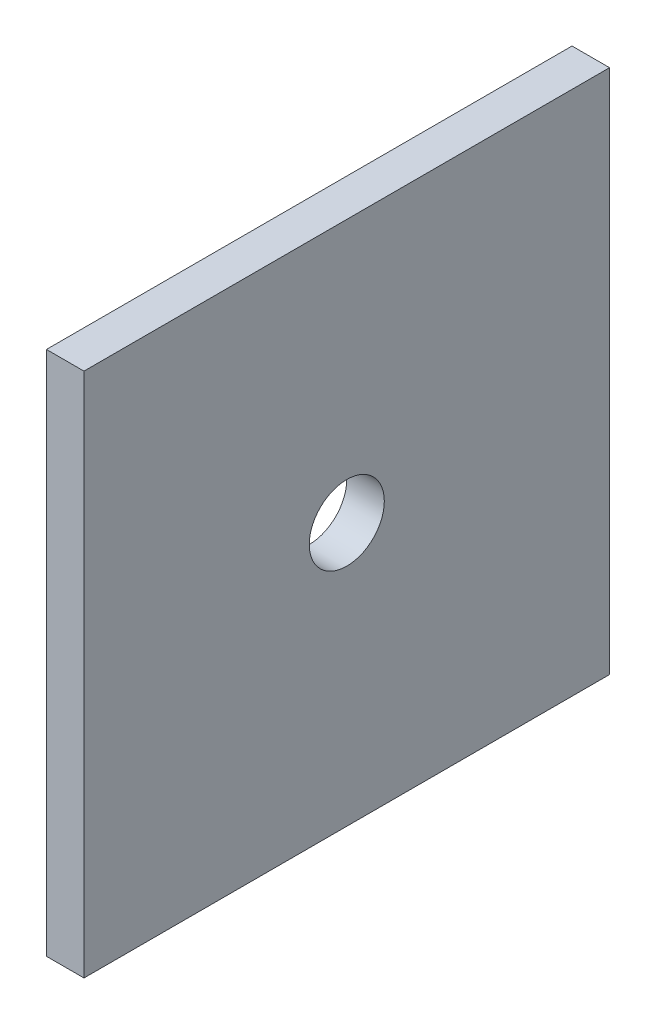
ISO-10303-21;
HEADER;
FILE_DESCRIPTION(('STEP AP214'),'2;1');
FILE_NAME('part.step','',(''),(''),'','','');
FILE_SCHEMA(('AUTOMOTIVE_DESIGN { 1 0 10303 214 1 1 1 1 }'));
ENDSEC;
DATA;
#1=APPLICATION_CONTEXT('core data for automotive mechanical design processes');
#2=APPLICATION_PROTOCOL_DEFINITION('international standard','automotive_design',2000,#1);
#3=PRODUCT_CONTEXT('',#1,'mechanical');
#4=PRODUCT('Part','Part','',(#3));
#5=PRODUCT_RELATED_PRODUCT_CATEGORY('part','',(#4));
#6=PRODUCT_DEFINITION_FORMATION('','',#4);
#7=PRODUCT_DEFINITION_CONTEXT('part definition',#1,'design');
#8=PRODUCT_DEFINITION('design','',#6,#7);
#9=PRODUCT_DEFINITION_SHAPE('','',#8);
#10=(LENGTH_UNIT() NAMED_UNIT(*) SI_UNIT(.MILLI.,.METRE.));
#11=(NAMED_UNIT(*) PLANE_ANGLE_UNIT() SI_UNIT($,.RADIAN.));
#12=(NAMED_UNIT(*) SI_UNIT($,.STERADIAN.) SOLID_ANGLE_UNIT());
#13=UNCERTAINTY_MEASURE_WITH_UNIT(LENGTH_MEASURE(1.E-05),#10,'distance_accuracy_value','');
#14=(GEOMETRIC_REPRESENTATION_CONTEXT(3) GLOBAL_UNCERTAINTY_ASSIGNED_CONTEXT((#13)) GLOBAL_UNIT_ASSIGNED_CONTEXT((#10,
#11,#12)) REPRESENTATION_CONTEXT('',''));
#15=CARTESIAN_POINT('',(0.,0.,0.));
#16=DIRECTION('',(0.,0.,1.));
#17=DIRECTION('',(1.,0.,0.));
#18=AXIS2_PLACEMENT_3D('',#15,#16,#17);
#19=CARTESIAN_POINT('',(5.,0.,0.));
#20=DIRECTION('',(1.,0.,0.));
#21=DIRECTION('',(0.,0.,-1.));
#22=AXIS2_PLACEMENT_3D('',#19,#20,#21);
#23=PLANE('',#22);
#24=DIRECTION('',(0.,-1.,0.));
#25=VECTOR('',#24,1.);
#26=CARTESIAN_POINT('',(5.,-35.,35.));
#27=LINE('',#26,#25);
#28=CARTESIAN_POINT('',(5.,35.,35.));
#29=VERTEX_POINT('',#28);
#30=CARTESIAN_POINT('',(5.,-35.,35.));
#31=VERTEX_POINT('',#30);
#32=EDGE_CURVE('E86',#29,#31,#27,.T.);
#33=ORIENTED_EDGE('',*,*,#32,.T.);
#34=DIRECTION('',(0.,0.,-1.));
#35=VECTOR('',#34,1.);
#36=CARTESIAN_POINT('',(5.,-35.,-35.));
#37=LINE('',#36,#35);
#38=CARTESIAN_POINT('',(5.,-35.,-35.));
#39=VERTEX_POINT('',#38);
#40=EDGE_CURVE('E81',#31,#39,#37,.T.);
#41=ORIENTED_EDGE('',*,*,#40,.T.);
#42=DIRECTION('',(0.,1.,0.));
#43=VECTOR('',#42,1.);
#44=CARTESIAN_POINT('',(5.,-35.,-35.));
#45=LINE('',#44,#43);
#46=CARTESIAN_POINT('',(5.,35.,-35.));
#47=VERTEX_POINT('',#46);
#48=EDGE_CURVE('E84',#39,#47,#45,.T.);
#49=ORIENTED_EDGE('',*,*,#48,.T.);
#50=DIRECTION('',(0.,0.,1.));
#51=VECTOR('',#50,1.);
#52=CARTESIAN_POINT('',(5.,35.,-35.));
#53=LINE('',#52,#51);
#54=EDGE_CURVE('E51',#47,#29,#53,.T.);
#55=ORIENTED_EDGE('',*,*,#54,.T.);
#56=EDGE_LOOP('',(#33,#41,#49,#55));
#57=FACE_BOUND('',#56,.T.);
#58=CARTESIAN_POINT('',(5.,0.,0.));
#59=DIRECTION('',(1.,0.,0.));
#60=DIRECTION('',(0.,0.,-1.));
#61=AXIS2_PLACEMENT_3D('',#58,#59,#60);
#62=CIRCLE('',#61,5.);
#63=CARTESIAN_POINT('',(5.,0.,-5.));
#64=VERTEX_POINT('',#63);
#65=EDGE_CURVE('E101',#64,#64,#62,.T.);
#66=ORIENTED_EDGE('',*,*,#65,.F.);
#67=EDGE_LOOP('',(#66));
#68=FACE_BOUND('',#67,.T.);
#69=ADVANCED_FACE('F34',(#57,#68),#23,.T.);
#70=CARTESIAN_POINT('',(0.,0.,0.));
#71=DIRECTION('',(1.,0.,0.));
#72=DIRECTION('',(0.,0.,-1.));
#73=AXIS2_PLACEMENT_3D('',#70,#71,#72);
#74=PLANE('',#73);
#75=DIRECTION('',(0.,-1.,0.));
#76=VECTOR('',#75,1.);
#77=CARTESIAN_POINT('',(0.,-35.,35.));
#78=LINE('',#77,#76);
#79=CARTESIAN_POINT('',(0.,35.,35.));
#80=VERTEX_POINT('',#79);
#81=CARTESIAN_POINT('',(0.,-35.,35.));
#82=VERTEX_POINT('',#81);
#83=EDGE_CURVE('E98',#80,#82,#78,.T.);
#84=ORIENTED_EDGE('',*,*,#83,.F.);
#85=DIRECTION('',(0.,0.,1.));
#86=VECTOR('',#85,1.);
#87=CARTESIAN_POINT('',(0.,35.,-35.));
#88=LINE('',#87,#86);
#89=CARTESIAN_POINT('',(0.,35.,-35.));
#90=VERTEX_POINT('',#89);
#91=EDGE_CURVE('E74',#90,#80,#88,.T.);
#92=ORIENTED_EDGE('',*,*,#91,.F.);
#93=DIRECTION('',(0.,1.,0.));
#94=VECTOR('',#93,1.);
#95=CARTESIAN_POINT('',(0.,-35.,-35.));
#96=LINE('',#95,#94);
#97=CARTESIAN_POINT('',(0.,-35.,-35.));
#98=VERTEX_POINT('',#97);
#99=EDGE_CURVE('E68',#98,#90,#96,.T.);
#100=ORIENTED_EDGE('',*,*,#99,.F.);
#101=DIRECTION('',(0.,0.,-1.));
#102=VECTOR('',#101,1.);
#103=CARTESIAN_POINT('',(0.,-35.,-35.));
#104=LINE('',#103,#102);
#105=EDGE_CURVE('E90',#82,#98,#104,.T.);
#106=ORIENTED_EDGE('',*,*,#105,.F.);
#107=EDGE_LOOP('',(#84,#92,#100,#106));
#108=FACE_BOUND('',#107,.T.);
#109=CARTESIAN_POINT('',(0.,0.,0.));
#110=DIRECTION('',(1.,0.,0.));
#111=DIRECTION('',(0.,0.,-1.));
#112=AXIS2_PLACEMENT_3D('',#109,#110,#111);
#113=CIRCLE('',#112,5.);
#114=CARTESIAN_POINT('',(0.,0.,-5.));
#115=VERTEX_POINT('',#114);
#116=EDGE_CURVE('E113',#115,#115,#113,.T.);
#117=ORIENTED_EDGE('',*,*,#116,.T.);
#118=EDGE_LOOP('',(#117));
#119=FACE_BOUND('',#118,.T.);
#120=ADVANCED_FACE('F109',(#108,#119),#74,.F.);
#121=CARTESIAN_POINT('',(5.,-35.,35.));
#122=DIRECTION('',(0.,0.,-1.));
#123=DIRECTION('',(-1.,0.,0.));
#124=AXIS2_PLACEMENT_3D('',#121,#122,#123);
#125=PLANE('',#124);
#126=ORIENTED_EDGE('',*,*,#83,.T.);
#127=DIRECTION('',(-1.,0.,0.));
#128=VECTOR('',#127,1.);
#129=CARTESIAN_POINT('',(5.,-35.,35.));
#130=LINE('',#129,#128);
#131=EDGE_CURVE('E11',#31,#82,#130,.T.);
#132=ORIENTED_EDGE('',*,*,#131,.F.);
#133=ORIENTED_EDGE('',*,*,#32,.F.);
#134=DIRECTION('',(-1.,0.,0.));
#135=VECTOR('',#134,1.);
#136=CARTESIAN_POINT('',(5.,35.,35.));
#137=LINE('',#136,#135);
#138=EDGE_CURVE('E94',#29,#80,#137,.T.);
#139=ORIENTED_EDGE('',*,*,#138,.T.);
#140=EDGE_LOOP('',(#126,#132,#133,#139));
#141=FACE_BOUND('',#140,.T.);
#142=ADVANCED_FACE('F36',(#141),#125,.F.);
#143=CARTESIAN_POINT('',(5.,-35.,-35.));
#144=DIRECTION('',(0.,1.,0.));
#145=DIRECTION('',(0.,0.,1.));
#146=AXIS2_PLACEMENT_3D('',#143,#144,#145);
#147=PLANE('',#146);
#148=ORIENTED_EDGE('',*,*,#105,.T.);
#149=DIRECTION('',(-1.,0.,0.));
#150=VECTOR('',#149,1.);
#151=CARTESIAN_POINT('',(5.,-35.,-35.));
#152=LINE('',#151,#150);
#153=EDGE_CURVE('E43',#39,#98,#152,.T.);
#154=ORIENTED_EDGE('',*,*,#153,.F.);
#155=ORIENTED_EDGE('',*,*,#40,.F.);
#156=ORIENTED_EDGE('',*,*,#131,.T.);
#157=EDGE_LOOP('',(#148,#154,#155,#156));
#158=FACE_BOUND('',#157,.T.);
#159=ADVANCED_FACE('F89',(#158),#147,.F.);
#160=CARTESIAN_POINT('',(5.,-35.,-35.));
#161=DIRECTION('',(0.,0.,1.));
#162=DIRECTION('',(0.,-1.,0.));
#163=AXIS2_PLACEMENT_3D('',#160,#161,#162);
#164=PLANE('',#163);
#165=ORIENTED_EDGE('',*,*,#99,.T.);
#166=DIRECTION('',(-1.,0.,0.));
#167=VECTOR('',#166,1.);
#168=CARTESIAN_POINT('',(5.,35.,-35.));
#169=LINE('',#168,#167);
#170=EDGE_CURVE('E91',#47,#90,#169,.T.);
#171=ORIENTED_EDGE('',*,*,#170,.F.);
#172=ORIENTED_EDGE('',*,*,#48,.F.);
#173=ORIENTED_EDGE('',*,*,#153,.T.);
#174=EDGE_LOOP('',(#165,#171,#172,#173));
#175=FACE_BOUND('',#174,.T.);
#176=ADVANCED_FACE('F92',(#175),#164,.F.);
#177=CARTESIAN_POINT('',(5.,35.,-35.));
#178=DIRECTION('',(0.,-1.,0.));
#179=DIRECTION('',(0.,0.,-1.));
#180=AXIS2_PLACEMENT_3D('',#177,#178,#179);
#181=PLANE('',#180);
#182=ORIENTED_EDGE('',*,*,#91,.T.);
#183=ORIENTED_EDGE('',*,*,#138,.F.);
#184=ORIENTED_EDGE('',*,*,#54,.F.);
#185=ORIENTED_EDGE('',*,*,#170,.T.);
#186=EDGE_LOOP('',(#182,#183,#184,#185));
#187=FACE_BOUND('',#186,.T.);
#188=ADVANCED_FACE('F106',(#187),#181,.F.);
#189=CARTESIAN_POINT('',(5.,0.,0.));
#190=DIRECTION('',(-1.,0.,0.));
#191=DIRECTION('',(0.,0.,1.));
#192=AXIS2_PLACEMENT_3D('',#189,#190,#191);
#193=CYLINDRICAL_SURFACE('',#192,5.);
#194=ORIENTED_EDGE('',*,*,#65,.T.);
#195=EDGE_LOOP('',(#194));
#196=FACE_BOUND('',#195,.T.);
#197=ORIENTED_EDGE('',*,*,#116,.F.);
#198=EDGE_LOOP('',(#197));
#199=FACE_BOUND('',#198,.T.);
#200=ADVANCED_FACE('F119',(#196,#199),#193,.F.);
#201=CLOSED_SHELL('',(#69,#120,#142,#159,#176,#188,#200));
#202=MANIFOLD_SOLID_BREP('B2',#201);
#203=ADVANCED_BREP_SHAPE_REPRESENTATION('',(#18,#202),#14);
#204=SHAPE_DEFINITION_REPRESENTATION(#9,#203);
ENDSEC;
END-ISO-10303-21;
